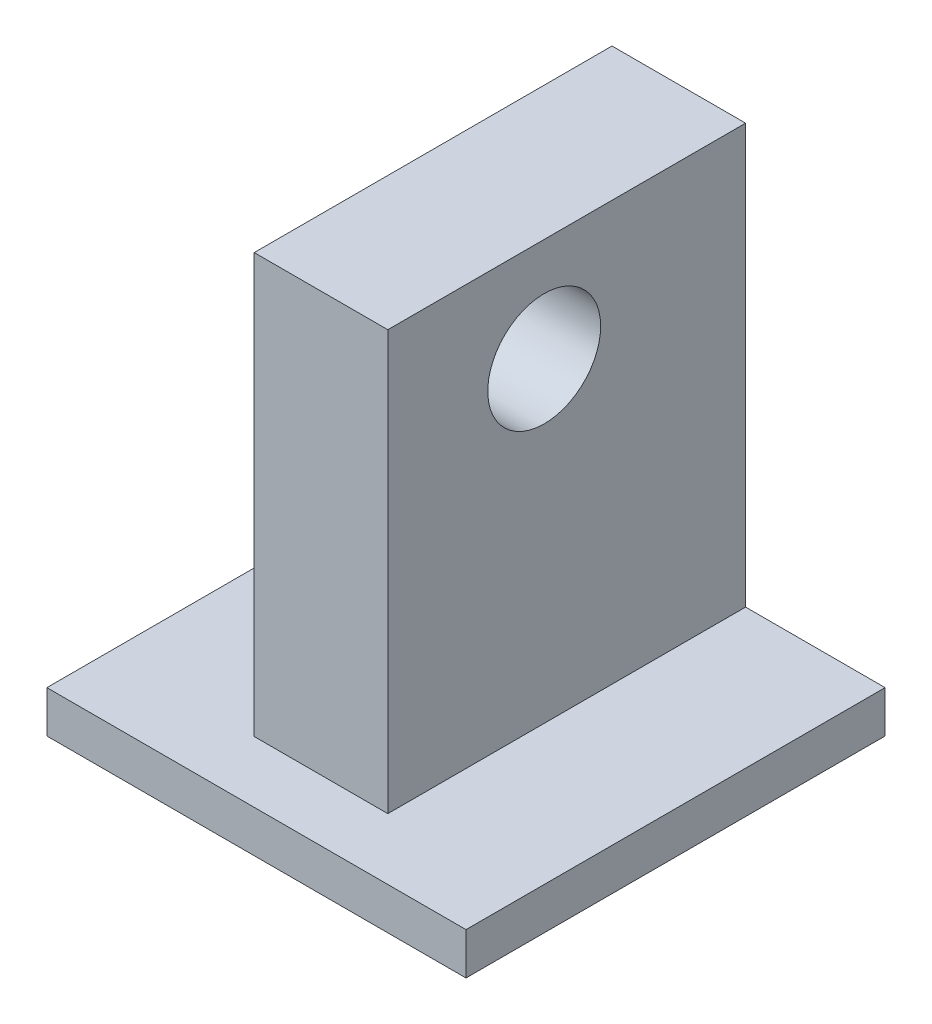
ISO-10303-21;
HEADER;
FILE_DESCRIPTION(('STEP AP214'),'2;1');
FILE_NAME('part.step','',(''),(''),'','','');
FILE_SCHEMA(('AUTOMOTIVE_DESIGN { 1 0 10303 214 1 1 1 1 }'));
ENDSEC;
DATA;
#1=APPLICATION_CONTEXT('core data for automotive mechanical design processes');
#2=APPLICATION_PROTOCOL_DEFINITION('international standard','automotive_design',2000,#1);
#3=PRODUCT_CONTEXT('',#1,'mechanical');
#4=PRODUCT('Part','Part','',(#3));
#5=PRODUCT_RELATED_PRODUCT_CATEGORY('part','',(#4));
#6=PRODUCT_DEFINITION_FORMATION('','',#4);
#7=PRODUCT_DEFINITION_CONTEXT('part definition',#1,'design');
#8=PRODUCT_DEFINITION('design','',#6,#7);
#9=PRODUCT_DEFINITION_SHAPE('','',#8);
#10=(LENGTH_UNIT() NAMED_UNIT(*) SI_UNIT(.MILLI.,.METRE.));
#11=(NAMED_UNIT(*) PLANE_ANGLE_UNIT() SI_UNIT($,.RADIAN.));
#12=(NAMED_UNIT(*) SI_UNIT($,.STERADIAN.) SOLID_ANGLE_UNIT());
#13=UNCERTAINTY_MEASURE_WITH_UNIT(LENGTH_MEASURE(1.E-05),#10,'distance_accuracy_value','');
#14=(GEOMETRIC_REPRESENTATION_CONTEXT(3) GLOBAL_UNCERTAINTY_ASSIGNED_CONTEXT((#13)) GLOBAL_UNIT_ASSIGNED_CONTEXT((#10,
#11,#12)) REPRESENTATION_CONTEXT('',''));
#15=CARTESIAN_POINT('',(0.,0.,0.));
#16=DIRECTION('',(0.,0.,1.));
#17=DIRECTION('',(1.,0.,0.));
#18=AXIS2_PLACEMENT_3D('',#15,#16,#17);
#19=CARTESIAN_POINT('',(15.,3.,-15.));
#20=DIRECTION('',(-1.,0.,0.));
#21=DIRECTION('',(0.,0.,1.));
#22=AXIS2_PLACEMENT_3D('',#19,#20,#21);
#23=PLANE('',#22);
#24=DIRECTION('',(0.,0.,-1.));
#25=VECTOR('',#24,1.);
#26=CARTESIAN_POINT('',(15.,0.,-15.));
#27=LINE('',#26,#25);
#28=CARTESIAN_POINT('',(15.,0.,15.));
#29=VERTEX_POINT('',#28);
#30=CARTESIAN_POINT('',(15.,0.,-15.));
#31=VERTEX_POINT('',#30);
#32=EDGE_CURVE('E119',#29,#31,#27,.T.);
#33=ORIENTED_EDGE('',*,*,#32,.T.);
#34=DIRECTION('',(0.,-1.,0.));
#35=VECTOR('',#34,1.);
#36=CARTESIAN_POINT('',(15.,3.,-15.));
#37=LINE('',#36,#35);
#38=CARTESIAN_POINT('',(15.,3.,-15.));
#39=VERTEX_POINT('',#38);
#40=EDGE_CURVE('E11',#39,#31,#37,.T.);
#41=ORIENTED_EDGE('',*,*,#40,.F.);
#42=DIRECTION('',(0.,0.,-1.));
#43=VECTOR('',#42,1.);
#44=CARTESIAN_POINT('',(15.,3.,-15.));
#45=LINE('',#44,#43);
#46=CARTESIAN_POINT('',(15.,3.,15.));
#47=VERTEX_POINT('',#46);
#48=EDGE_CURVE('E128',#47,#39,#45,.T.);
#49=ORIENTED_EDGE('',*,*,#48,.F.);
#50=DIRECTION('',(0.,-1.,0.));
#51=VECTOR('',#50,1.);
#52=CARTESIAN_POINT('',(15.,3.,15.));
#53=LINE('',#52,#51);
#54=EDGE_CURVE('E148',#47,#29,#53,.T.);
#55=ORIENTED_EDGE('',*,*,#54,.T.);
#56=EDGE_LOOP('',(#33,#41,#49,#55));
#57=FACE_BOUND('',#56,.T.);
#58=ADVANCED_FACE('F33',(#57),#23,.F.);
#59=CARTESIAN_POINT('',(-15.,3.,-15.));
#60=DIRECTION('',(0.,0.,1.));
#61=DIRECTION('',(1.,0.,0.));
#62=AXIS2_PLACEMENT_3D('',#59,#60,#61);
#63=PLANE('',#62);
#64=DIRECTION('',(-1.,0.,0.));
#65=VECTOR('',#64,1.);
#66=CARTESIAN_POINT('',(-15.,0.,-15.));
#67=LINE('',#66,#65);
#68=CARTESIAN_POINT('',(-15.,0.,-15.));
#69=VERTEX_POINT('',#68);
#70=EDGE_CURVE('E122',#31,#69,#67,.T.);
#71=ORIENTED_EDGE('',*,*,#70,.T.);
#72=DIRECTION('',(0.,-1.,0.));
#73=VECTOR('',#72,1.);
#74=CARTESIAN_POINT('',(-15.,3.,-15.));
#75=LINE('',#74,#73);
#76=CARTESIAN_POINT('',(-15.,3.,-15.));
#77=VERTEX_POINT('',#76);
#78=EDGE_CURVE('E41',#77,#69,#75,.T.);
#79=ORIENTED_EDGE('',*,*,#78,.F.);
#80=DIRECTION('',(-1.,0.,0.));
#81=VECTOR('',#80,1.);
#82=CARTESIAN_POINT('',(-15.,3.,-15.));
#83=LINE('',#82,#81);
#84=CARTESIAN_POINT('',(-4.54924775272047,3.,-15.));
#85=VERTEX_POINT('',#84);
#86=EDGE_CURVE('E131',#85,#77,#83,.T.);
#87=ORIENTED_EDGE('',*,*,#86,.F.);
#88=DIRECTION('',(0.,-1.,0.));
#89=VECTOR('',#88,1.);
#90=CARTESIAN_POINT('',(-4.54924775272047,33.,-15.));
#91=LINE('',#90,#89);
#92=CARTESIAN_POINT('',(-4.54924775272047,33.,-15.));
#93=VERTEX_POINT('',#92);
#94=EDGE_CURVE('E179',#93,#85,#91,.T.);
#95=ORIENTED_EDGE('',*,*,#94,.F.);
#96=DIRECTION('',(-1.,0.,0.));
#97=VECTOR('',#96,1.);
#98=CARTESIAN_POINT('',(-4.54924775272047,33.,-15.));
#99=LINE('',#98,#97);
#100=CARTESIAN_POINT('',(5.01385946108712,33.,-15.));
#101=VERTEX_POINT('',#100);
#102=EDGE_CURVE('E112',#101,#93,#99,.T.);
#103=ORIENTED_EDGE('',*,*,#102,.F.);
#104=DIRECTION('',(0.,-1.,0.));
#105=VECTOR('',#104,1.);
#106=CARTESIAN_POINT('',(5.01385946108712,33.,-15.));
#107=LINE('',#106,#105);
#108=CARTESIAN_POINT('',(5.01385946108712,3.,-15.));
#109=VERTEX_POINT('',#108);
#110=EDGE_CURVE('E124',#101,#109,#107,.T.);
#111=ORIENTED_EDGE('',*,*,#110,.T.);
#112=EDGE_CURVE('E141',#39,#109,#83,.T.);
#113=ORIENTED_EDGE('',*,*,#112,.F.);
#114=ORIENTED_EDGE('',*,*,#40,.T.);
#115=EDGE_LOOP('',(#71,#79,#87,#95,#103,#111,#113,#114));
#116=FACE_BOUND('',#115,.T.);
#117=ADVANCED_FACE('F178',(#116),#63,.F.);
#118=CARTESIAN_POINT('',(-15.,3.,-15.));
#119=DIRECTION('',(1.,0.,0.));
#120=DIRECTION('',(0.,0.,-1.));
#121=AXIS2_PLACEMENT_3D('',#118,#119,#120);
#122=PLANE('',#121);
#123=DIRECTION('',(0.,0.,1.));
#124=VECTOR('',#123,1.);
#125=CARTESIAN_POINT('',(-15.,0.,-15.));
#126=LINE('',#125,#124);
#127=CARTESIAN_POINT('',(-15.,0.,15.));
#128=VERTEX_POINT('',#127);
#129=EDGE_CURVE('E153',#69,#128,#126,.T.);
#130=ORIENTED_EDGE('',*,*,#129,.T.);
#131=DIRECTION('',(0.,-1.,0.));
#132=VECTOR('',#131,1.);
#133=CARTESIAN_POINT('',(-15.,3.,15.));
#134=LINE('',#133,#132);
#135=CARTESIAN_POINT('',(-15.,3.,15.));
#136=VERTEX_POINT('',#135);
#137=EDGE_CURVE('E145',#136,#128,#134,.T.);
#138=ORIENTED_EDGE('',*,*,#137,.F.);
#139=DIRECTION('',(0.,0.,1.));
#140=VECTOR('',#139,1.);
#141=CARTESIAN_POINT('',(-15.,3.,-15.));
#142=LINE('',#141,#140);
#143=EDGE_CURVE('E135',#77,#136,#142,.T.);
#144=ORIENTED_EDGE('',*,*,#143,.F.);
#145=ORIENTED_EDGE('',*,*,#78,.T.);
#146=EDGE_LOOP('',(#130,#138,#144,#145));
#147=FACE_BOUND('',#146,.T.);
#148=ADVANCED_FACE('F162',(#147),#122,.F.);
#149=CARTESIAN_POINT('',(-15.,3.,15.));
#150=DIRECTION('',(0.,0.,-1.));
#151=DIRECTION('',(-1.,0.,0.));
#152=AXIS2_PLACEMENT_3D('',#149,#150,#151);
#153=PLANE('',#152);
#154=DIRECTION('',(1.,0.,0.));
#155=VECTOR('',#154,1.);
#156=CARTESIAN_POINT('',(-15.,0.,15.));
#157=LINE('',#156,#155);
#158=EDGE_CURVE('E132',#128,#29,#157,.T.);
#159=ORIENTED_EDGE('',*,*,#158,.T.);
#160=ORIENTED_EDGE('',*,*,#54,.F.);
#161=DIRECTION('',(1.,0.,0.));
#162=VECTOR('',#161,1.);
#163=CARTESIAN_POINT('',(-15.,3.,15.));
#164=LINE('',#163,#162);
#165=EDGE_CURVE('E151',#136,#47,#164,.T.);
#166=ORIENTED_EDGE('',*,*,#165,.F.);
#167=ORIENTED_EDGE('',*,*,#137,.T.);
#168=EDGE_LOOP('',(#159,#160,#166,#167));
#169=FACE_BOUND('',#168,.T.);
#170=ADVANCED_FACE('F166',(#169),#153,.F.);
#171=CARTESIAN_POINT('',(0.,3.,0.));
#172=DIRECTION('',(0.,1.,0.));
#173=DIRECTION('',(0.,0.,1.));
#174=AXIS2_PLACEMENT_3D('',#171,#172,#173);
#175=PLANE('',#174);
#176=DIRECTION('',(0.,0.,1.));
#177=VECTOR('',#176,1.);
#178=CARTESIAN_POINT('',(-4.54924775272047,3.,-15.));
#179=LINE('',#178,#177);
#180=CARTESIAN_POINT('',(-4.54924775272047,3.,10.6106506688377));
#181=VERTEX_POINT('',#180);
#182=EDGE_CURVE('E54',#85,#181,#179,.T.);
#183=ORIENTED_EDGE('',*,*,#182,.F.);
#184=ORIENTED_EDGE('',*,*,#86,.T.);
#185=ORIENTED_EDGE('',*,*,#143,.T.);
#186=ORIENTED_EDGE('',*,*,#165,.T.);
#187=ORIENTED_EDGE('',*,*,#48,.T.);
#188=ORIENTED_EDGE('',*,*,#112,.T.);
#189=DIRECTION('',(0.,0.,-1.));
#190=VECTOR('',#189,1.);
#191=CARTESIAN_POINT('',(5.01385946108712,3.,-15.));
#192=LINE('',#191,#190);
#193=CARTESIAN_POINT('',(5.01385946108712,3.,10.6106506688377));
#194=VERTEX_POINT('',#193);
#195=EDGE_CURVE('E116',#194,#109,#192,.T.);
#196=ORIENTED_EDGE('',*,*,#195,.F.);
#197=DIRECTION('',(1.,0.,0.));
#198=VECTOR('',#197,1.);
#199=CARTESIAN_POINT('',(-4.54924775272047,3.,10.6106506688377));
#200=LINE('',#199,#198);
#201=EDGE_CURVE('E49',#181,#194,#200,.T.);
#202=ORIENTED_EDGE('',*,*,#201,.F.);
#203=EDGE_LOOP('',(#183,#184,#185,#186,#187,#188,#196,#202));
#204=FACE_BOUND('',#203,.T.);
#205=ADVANCED_FACE('F159',(#204),#175,.T.);
#206=CARTESIAN_POINT('',(0.,0.,0.));
#207=DIRECTION('',(0.,1.,0.));
#208=DIRECTION('',(0.,0.,1.));
#209=AXIS2_PLACEMENT_3D('',#206,#207,#208);
#210=PLANE('',#209);
#211=ORIENTED_EDGE('',*,*,#32,.F.);
#212=ORIENTED_EDGE('',*,*,#158,.F.);
#213=ORIENTED_EDGE('',*,*,#129,.F.);
#214=ORIENTED_EDGE('',*,*,#70,.F.);
#215=EDGE_LOOP('',(#211,#212,#213,#214));
#216=FACE_BOUND('',#215,.T.);
#217=ADVANCED_FACE('F217',(#216),#210,.F.);
#218=CARTESIAN_POINT('',(-4.54924775272047,33.,-15.));
#219=DIRECTION('',(1.,0.,0.));
#220=DIRECTION('',(0.,0.,-1.));
#221=AXIS2_PLACEMENT_3D('',#218,#219,#220);
#222=PLANE('',#221);
#223=CARTESIAN_POINT('',(-4.54924775272047,25.6037384218644,-0.584677197977612));
#224=DIRECTION('',(1.,0.,0.));
#225=DIRECTION('',(0.,0.,-1.));
#226=AXIS2_PLACEMENT_3D('',#223,#224,#225);
#227=CIRCLE('',#226,4.03940720021012);
#228=CARTESIAN_POINT('',(-4.54924775272047,25.6037384218644,-4.62408439818773));
#229=VERTEX_POINT('',#228);
#230=EDGE_CURVE('E188',#229,#229,#227,.T.);
#231=ORIENTED_EDGE('',*,*,#230,.T.);
#232=EDGE_LOOP('',(#231));
#233=FACE_BOUND('',#232,.T.);
#234=ORIENTED_EDGE('',*,*,#182,.T.);
#235=DIRECTION('',(0.,-1.,0.));
#236=VECTOR('',#235,1.);
#237=CARTESIAN_POINT('',(-4.54924775272047,33.,10.6106506688377));
#238=LINE('',#237,#236);
#239=CARTESIAN_POINT('',(-4.54924775272047,33.,10.6106506688377));
#240=VERTEX_POINT('',#239);
#241=EDGE_CURVE('E101',#240,#181,#238,.T.);
#242=ORIENTED_EDGE('',*,*,#241,.F.);
#243=DIRECTION('',(0.,0.,1.));
#244=VECTOR('',#243,1.);
#245=CARTESIAN_POINT('',(-4.54924775272047,33.,-15.));
#246=LINE('',#245,#244);
#247=EDGE_CURVE('E107',#93,#240,#246,.T.);
#248=ORIENTED_EDGE('',*,*,#247,.F.);
#249=ORIENTED_EDGE('',*,*,#94,.T.);
#250=EDGE_LOOP('',(#234,#242,#248,#249));
#251=FACE_BOUND('',#250,.T.);
#252=ADVANCED_FACE('F118',(#233,#251),#222,.F.);
#253=CARTESIAN_POINT('',(-4.54924775272047,33.,10.6106506688377));
#254=DIRECTION('',(0.,0.,-1.));
#255=DIRECTION('',(-1.,0.,0.));
#256=AXIS2_PLACEMENT_3D('',#253,#254,#255);
#257=PLANE('',#256);
#258=ORIENTED_EDGE('',*,*,#201,.T.);
#259=DIRECTION('',(0.,-1.,0.));
#260=VECTOR('',#259,1.);
#261=CARTESIAN_POINT('',(5.01385946108712,33.,10.6106506688377));
#262=LINE('',#261,#260);
#263=CARTESIAN_POINT('',(5.01385946108712,33.,10.6106506688377));
#264=VERTEX_POINT('',#263);
#265=EDGE_CURVE('E103',#264,#194,#262,.T.);
#266=ORIENTED_EDGE('',*,*,#265,.F.);
#267=DIRECTION('',(1.,0.,0.));
#268=VECTOR('',#267,1.);
#269=CARTESIAN_POINT('',(-4.54924775272047,33.,10.6106506688377));
#270=LINE('',#269,#268);
#271=EDGE_CURVE('E97',#240,#264,#270,.T.);
#272=ORIENTED_EDGE('',*,*,#271,.F.);
#273=ORIENTED_EDGE('',*,*,#241,.T.);
#274=EDGE_LOOP('',(#258,#266,#272,#273));
#275=FACE_BOUND('',#274,.T.);
#276=ADVANCED_FACE('F99',(#275),#257,.F.);
#277=CARTESIAN_POINT('',(5.01385946108712,33.,-15.));
#278=DIRECTION('',(-1.,0.,0.));
#279=DIRECTION('',(0.,0.,1.));
#280=AXIS2_PLACEMENT_3D('',#277,#278,#279);
#281=PLANE('',#280);
#282=CARTESIAN_POINT('',(5.01385946108712,25.6037384218644,-0.584677197977613));
#283=DIRECTION('',(1.,0.,0.));
#284=DIRECTION('',(0.,0.,-1.));
#285=AXIS2_PLACEMENT_3D('',#282,#283,#284);
#286=CIRCLE('',#285,4.03940720021012);
#287=CARTESIAN_POINT('',(5.01385946108712,25.6037384218644,-4.62408439818773));
#288=VERTEX_POINT('',#287);
#289=EDGE_CURVE('E191',#288,#288,#286,.T.);
#290=ORIENTED_EDGE('',*,*,#289,.F.);
#291=EDGE_LOOP('',(#290));
#292=FACE_BOUND('',#291,.T.);
#293=ORIENTED_EDGE('',*,*,#195,.T.);
#294=ORIENTED_EDGE('',*,*,#110,.F.);
#295=DIRECTION('',(0.,0.,-1.));
#296=VECTOR('',#295,1.);
#297=CARTESIAN_POINT('',(5.01385946108712,33.,-15.));
#298=LINE('',#297,#296);
#299=EDGE_CURVE('E106',#264,#101,#298,.T.);
#300=ORIENTED_EDGE('',*,*,#299,.F.);
#301=ORIENTED_EDGE('',*,*,#265,.T.);
#302=EDGE_LOOP('',(#293,#294,#300,#301));
#303=FACE_BOUND('',#302,.T.);
#304=ADVANCED_FACE('F176',(#292,#303),#281,.F.);
#305=CARTESIAN_POINT('',(0.,33.,0.));
#306=DIRECTION('',(0.,1.,0.));
#307=DIRECTION('',(0.,0.,1.));
#308=AXIS2_PLACEMENT_3D('',#305,#306,#307);
#309=PLANE('',#308);
#310=ORIENTED_EDGE('',*,*,#247,.T.);
#311=ORIENTED_EDGE('',*,*,#271,.T.);
#312=ORIENTED_EDGE('',*,*,#299,.T.);
#313=ORIENTED_EDGE('',*,*,#102,.T.);
#314=EDGE_LOOP('',(#310,#311,#312,#313));
#315=FACE_BOUND('',#314,.T.);
#316=ADVANCED_FACE('F110',(#315),#309,.T.);
#317=CARTESIAN_POINT('',(-4.98614053891288,25.6037384218644,-0.584677197977612));
#318=DIRECTION('',(1.,0.,0.));
#319=DIRECTION('',(0.,0.,-1.));
#320=AXIS2_PLACEMENT_3D('',#317,#318,#319);
#321=CYLINDRICAL_SURFACE('',#320,4.03940720021012);
#322=ORIENTED_EDGE('',*,*,#289,.T.);
#323=EDGE_LOOP('',(#322));
#324=FACE_BOUND('',#323,.T.);
#325=ORIENTED_EDGE('',*,*,#230,.F.);
#326=EDGE_LOOP('',(#325));
#327=FACE_BOUND('',#326,.T.);
#328=ADVANCED_FACE('F195',(#324,#327),#321,.F.);
#329=CLOSED_SHELL('',(#58,#117,#148,#170,#205,#217,#252,#276,#304,#316,#328));
#330=MANIFOLD_SOLID_BREP('B2',#329);
#331=ADVANCED_BREP_SHAPE_REPRESENTATION('',(#18,#330),#14);
#332=SHAPE_DEFINITION_REPRESENTATION(#9,#331);
ENDSEC;
END-ISO-10303-21;
